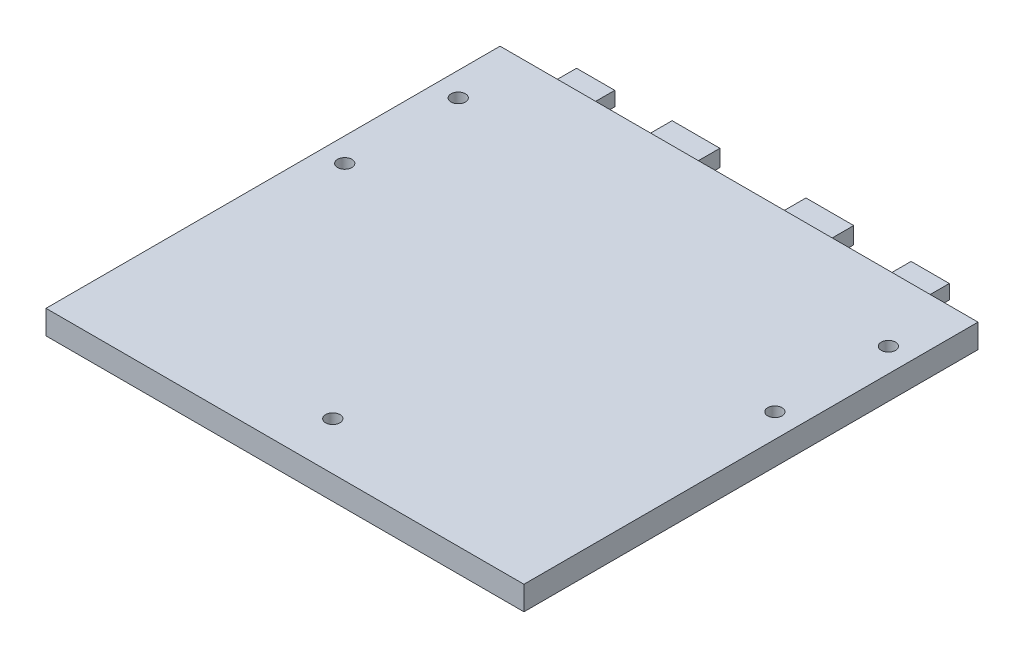
ISO-10303-21;
HEADER;
FILE_DESCRIPTION(('STEP AP214'),'2;1');
FILE_NAME('part.step','',(''),(''),'','','');
FILE_SCHEMA(('AUTOMOTIVE_DESIGN { 1 0 10303 214 1 1 1 1 }'));
ENDSEC;
DATA;
#1=APPLICATION_CONTEXT('core data for automotive mechanical design processes');
#2=APPLICATION_PROTOCOL_DEFINITION('international standard','automotive_design',2000,#1);
#3=PRODUCT_CONTEXT('',#1,'mechanical');
#4=PRODUCT('Part','Part','',(#3));
#5=PRODUCT_RELATED_PRODUCT_CATEGORY('part','',(#4));
#6=PRODUCT_DEFINITION_FORMATION('','',#4);
#7=PRODUCT_DEFINITION_CONTEXT('part definition',#1,'design');
#8=PRODUCT_DEFINITION('design','',#6,#7);
#9=PRODUCT_DEFINITION_SHAPE('','',#8);
#10=(LENGTH_UNIT() NAMED_UNIT(*) SI_UNIT(.MILLI.,.METRE.));
#11=(NAMED_UNIT(*) PLANE_ANGLE_UNIT() SI_UNIT($,.RADIAN.));
#12=(NAMED_UNIT(*) SI_UNIT($,.STERADIAN.) SOLID_ANGLE_UNIT());
#13=UNCERTAINTY_MEASURE_WITH_UNIT(LENGTH_MEASURE(1.E-05),#10,'distance_accuracy_value','');
#14=(GEOMETRIC_REPRESENTATION_CONTEXT(3) GLOBAL_UNCERTAINTY_ASSIGNED_CONTEXT((#13)) GLOBAL_UNIT_ASSIGNED_CONTEXT((#10,
#11,#12)) REPRESENTATION_CONTEXT('',''));
#15=CARTESIAN_POINT('',(0.,0.,0.));
#16=DIRECTION('',(0.,0.,1.));
#17=DIRECTION('',(1.,0.,0.));
#18=AXIS2_PLACEMENT_3D('',#15,#16,#17);
#19=CARTESIAN_POINT('',(0.,10.,0.));
#20=DIRECTION('',(0.,-1.,0.));
#21=DIRECTION('',(0.,0.,-1.));
#22=AXIS2_PLACEMENT_3D('',#19,#20,#21);
#23=PLANE('',#22);
#24=CARTESIAN_POINT('',(100.,10.,-20.));
#25=DIRECTION('',(0.,1.,0.));
#26=DIRECTION('',(0.,0.,1.));
#27=AXIS2_PLACEMENT_3D('',#24,#25,#26);
#28=CIRCLE('',#27,3.00000000000001);
#29=CARTESIAN_POINT('',(100.,10.,-17.));
#30=VERTEX_POINT('',#29);
#31=EDGE_CURVE('E621',#30,#30,#28,.T.);
#32=ORIENTED_EDGE('',*,*,#31,.F.);
#33=EDGE_LOOP('',(#32));
#34=FACE_BOUND('',#33,.T.);
#35=CARTESIAN_POINT('',(190.,10.,-162.5));
#36=DIRECTION('',(0.,1.,0.));
#37=DIRECTION('',(0.,0.,1.));
#38=AXIS2_PLACEMENT_3D('',#35,#36,#37);
#39=CIRCLE('',#38,2.99999999999999);
#40=CARTESIAN_POINT('',(190.,10.,-159.5));
#41=VERTEX_POINT('',#40);
#42=EDGE_CURVE('E632',#41,#41,#39,.T.);
#43=ORIENTED_EDGE('',*,*,#42,.F.);
#44=EDGE_LOOP('',(#43));
#45=FACE_BOUND('',#44,.T.);
#46=CARTESIAN_POINT('',(190.,10.,-115.));
#47=DIRECTION('',(0.,1.,0.));
#48=DIRECTION('',(0.,0.,1.));
#49=AXIS2_PLACEMENT_3D('',#46,#47,#48);
#50=CIRCLE('',#49,2.99999999999999);
#51=CARTESIAN_POINT('',(190.,10.,-112.));
#52=VERTEX_POINT('',#51);
#53=EDGE_CURVE('E635',#52,#52,#50,.T.);
#54=ORIENTED_EDGE('',*,*,#53,.F.);
#55=EDGE_LOOP('',(#54));
#56=FACE_BOUND('',#55,.T.);
#57=DIRECTION('',(0.,0.,1.));
#58=VECTOR('',#57,1.);
#59=CARTESIAN_POINT('',(0.,10.,0.));
#60=LINE('',#59,#58);
#61=CARTESIAN_POINT('',(0.,10.,-190.));
#62=VERTEX_POINT('',#61);
#63=CARTESIAN_POINT('',(0.,10.,0.));
#64=VERTEX_POINT('',#63);
#65=EDGE_CURVE('E299',#62,#64,#60,.T.);
#66=ORIENTED_EDGE('',*,*,#65,.T.);
#67=DIRECTION('',(1.,0.,0.));
#68=VECTOR('',#67,1.);
#69=CARTESIAN_POINT('',(0.,10.,0.));
#70=LINE('',#69,#68);
#71=CARTESIAN_POINT('',(200.,10.,0.));
#72=VERTEX_POINT('',#71);
#73=EDGE_CURVE('E302',#64,#72,#70,.T.);
#74=ORIENTED_EDGE('',*,*,#73,.T.);
#75=DIRECTION('',(0.,0.,-1.));
#76=VECTOR('',#75,1.);
#77=CARTESIAN_POINT('',(200.,10.,0.));
#78=LINE('',#77,#76);
#79=CARTESIAN_POINT('',(200.,10.,-190.));
#80=VERTEX_POINT('',#79);
#81=EDGE_CURVE('E305',#72,#80,#78,.T.);
#82=ORIENTED_EDGE('',*,*,#81,.T.);
#83=DIRECTION('',(-1.,0.,0.));
#84=VECTOR('',#83,1.);
#85=CARTESIAN_POINT('',(0.,10.,-190.));
#86=LINE('',#85,#84);
#87=EDGE_CURVE('E307',#80,#62,#86,.T.);
#88=ORIENTED_EDGE('',*,*,#87,.T.);
#89=EDGE_LOOP('',(#66,#74,#82,#88));
#90=FACE_BOUND('',#89,.T.);
#91=CARTESIAN_POINT('',(10.,10.,-162.5));
#92=DIRECTION('',(0.,-1.,0.));
#93=DIRECTION('',(0.,0.,-1.));
#94=AXIS2_PLACEMENT_3D('',#91,#92,#93);
#95=CIRCLE('',#94,2.99999999999999);
#96=CARTESIAN_POINT('',(10.,10.,-165.5));
#97=VERTEX_POINT('',#96);
#98=EDGE_CURVE('E626',#97,#97,#95,.T.);
#99=ORIENTED_EDGE('',*,*,#98,.T.);
#100=EDGE_LOOP('',(#99));
#101=FACE_BOUND('',#100,.T.);
#102=CARTESIAN_POINT('',(10.,10.,-115.));
#103=DIRECTION('',(0.,-1.,0.));
#104=DIRECTION('',(0.,0.,-1.));
#105=AXIS2_PLACEMENT_3D('',#102,#103,#104);
#106=CIRCLE('',#105,2.99999999999999);
#107=CARTESIAN_POINT('',(10.,10.,-118.));
#108=VERTEX_POINT('',#107);
#109=EDGE_CURVE('E639',#108,#108,#106,.T.);
#110=ORIENTED_EDGE('',*,*,#109,.T.);
#111=EDGE_LOOP('',(#110));
#112=FACE_BOUND('',#111,.T.);
#113=ADVANCED_FACE('F34',(#34,#45,#56,#90,#101,#112),#23,.F.);
#114=CARTESIAN_POINT('',(0.,0.,0.));
#115=DIRECTION('',(0.,-1.,0.));
#116=DIRECTION('',(0.,0.,-1.));
#117=AXIS2_PLACEMENT_3D('',#114,#115,#116);
#118=PLANE('',#117);
#119=CARTESIAN_POINT('',(100.,0.,-20.));
#120=DIRECTION('',(0.,1.,0.));
#121=DIRECTION('',(0.,0.,1.));
#122=AXIS2_PLACEMENT_3D('',#119,#120,#121);
#123=CIRCLE('',#122,3.00000000000001);
#124=CARTESIAN_POINT('',(100.,0.,-17.));
#125=VERTEX_POINT('',#124);
#126=EDGE_CURVE('E619',#125,#125,#123,.T.);
#127=ORIENTED_EDGE('',*,*,#126,.T.);
#128=EDGE_LOOP('',(#127));
#129=FACE_BOUND('',#128,.T.);
#130=CARTESIAN_POINT('',(190.,0.,-162.5));
#131=DIRECTION('',(0.,1.,0.));
#132=DIRECTION('',(0.,0.,1.));
#133=AXIS2_PLACEMENT_3D('',#130,#131,#132);
#134=CIRCLE('',#133,2.99999999999999);
#135=CARTESIAN_POINT('',(190.,0.,-159.5));
#136=VERTEX_POINT('',#135);
#137=EDGE_CURVE('E636',#136,#136,#134,.T.);
#138=ORIENTED_EDGE('',*,*,#137,.T.);
#139=EDGE_LOOP('',(#138));
#140=FACE_BOUND('',#139,.T.);
#141=CARTESIAN_POINT('',(10.,0.,-162.5));
#142=DIRECTION('',(0.,-1.,0.));
#143=DIRECTION('',(0.,0.,-1.));
#144=AXIS2_PLACEMENT_3D('',#141,#142,#143);
#145=CIRCLE('',#144,2.99999999999999);
#146=CARTESIAN_POINT('',(10.,0.,-165.5));
#147=VERTEX_POINT('',#146);
#148=EDGE_CURVE('E623',#147,#147,#145,.T.);
#149=ORIENTED_EDGE('',*,*,#148,.F.);
#150=EDGE_LOOP('',(#149));
#151=FACE_BOUND('',#150,.T.);
#152=CARTESIAN_POINT('',(190.,0.,-115.));
#153=DIRECTION('',(0.,1.,0.));
#154=DIRECTION('',(0.,0.,1.));
#155=AXIS2_PLACEMENT_3D('',#152,#153,#154);
#156=CIRCLE('',#155,2.99999999999999);
#157=CARTESIAN_POINT('',(190.,0.,-112.));
#158=VERTEX_POINT('',#157);
#159=EDGE_CURVE('E644',#158,#158,#156,.T.);
#160=ORIENTED_EDGE('',*,*,#159,.T.);
#161=EDGE_LOOP('',(#160));
#162=FACE_BOUND('',#161,.T.);
#163=DIRECTION('',(0.,0.,1.));
#164=VECTOR('',#163,1.);
#165=CARTESIAN_POINT('',(0.,0.,0.));
#166=LINE('',#165,#164);
#167=CARTESIAN_POINT('',(0.,0.,-190.));
#168=VERTEX_POINT('',#167);
#169=CARTESIAN_POINT('',(0.,0.,0.));
#170=VERTEX_POINT('',#169);
#171=EDGE_CURVE('E290',#168,#170,#166,.T.);
#172=ORIENTED_EDGE('',*,*,#171,.F.);
#173=DIRECTION('',(-1.,0.,0.));
#174=VECTOR('',#173,1.);
#175=CARTESIAN_POINT('',(0.,0.,-190.));
#176=LINE('',#175,#174);
#177=CARTESIAN_POINT('',(200.,0.,-190.));
#178=VERTEX_POINT('',#177);
#179=EDGE_CURVE('E303',#178,#168,#176,.T.);
#180=ORIENTED_EDGE('',*,*,#179,.F.);
#181=DIRECTION('',(0.,0.,-1.));
#182=VECTOR('',#181,1.);
#183=CARTESIAN_POINT('',(200.,0.,0.));
#184=LINE('',#183,#182);
#185=CARTESIAN_POINT('',(200.,0.,0.));
#186=VERTEX_POINT('',#185);
#187=EDGE_CURVE('E314',#186,#178,#184,.T.);
#188=ORIENTED_EDGE('',*,*,#187,.F.);
#189=DIRECTION('',(1.,0.,0.));
#190=VECTOR('',#189,1.);
#191=CARTESIAN_POINT('',(0.,0.,0.));
#192=LINE('',#191,#190);
#193=EDGE_CURVE('E312',#170,#186,#192,.T.);
#194=ORIENTED_EDGE('',*,*,#193,.F.);
#195=EDGE_LOOP('',(#172,#180,#188,#194));
#196=FACE_BOUND('',#195,.T.);
#197=CARTESIAN_POINT('',(10.,0.,-115.));
#198=DIRECTION('',(0.,-1.,0.));
#199=DIRECTION('',(0.,0.,-1.));
#200=AXIS2_PLACEMENT_3D('',#197,#198,#199);
#201=CIRCLE('',#200,2.99999999999999);
#202=CARTESIAN_POINT('',(10.,0.,-118.));
#203=VERTEX_POINT('',#202);
#204=EDGE_CURVE('E629',#203,#203,#201,.T.);
#205=ORIENTED_EDGE('',*,*,#204,.F.);
#206=EDGE_LOOP('',(#205));
#207=FACE_BOUND('',#206,.T.);
#208=ADVANCED_FACE('F332',(#129,#140,#151,#162,#196,#207),#118,.T.);
#209=CARTESIAN_POINT('',(0.,10.,-190.));
#210=DIRECTION('',(0.,0.,1.));
#211=DIRECTION('',(1.,0.,0.));
#212=AXIS2_PLACEMENT_3D('',#209,#210,#211);
#213=PLANE('',#212);
#214=DIRECTION('',(1.,0.,0.));
#215=VECTOR('',#214,1.);
#216=CARTESIAN_POINT('',(62.,9.,-190.));
#217=LINE('',#216,#215);
#218=CARTESIAN_POINT('',(62.,9.,-190.));
#219=VERTEX_POINT('',#218);
#220=CARTESIAN_POINT('',(82.,9.,-190.));
#221=VERTEX_POINT('',#220);
#222=EDGE_CURVE('E255',#219,#221,#217,.T.);
#223=ORIENTED_EDGE('',*,*,#222,.F.);
#224=DIRECTION('',(0.,1.,0.));
#225=VECTOR('',#224,1.);
#226=CARTESIAN_POINT('',(62.,2.,-190.));
#227=LINE('',#226,#225);
#228=CARTESIAN_POINT('',(62.,2.,-190.));
#229=VERTEX_POINT('',#228);
#230=EDGE_CURVE('E247',#229,#219,#227,.T.);
#231=ORIENTED_EDGE('',*,*,#230,.F.);
#232=DIRECTION('',(1.,0.,0.));
#233=VECTOR('',#232,1.);
#234=CARTESIAN_POINT('',(62.,2.,-190.));
#235=LINE('',#234,#233);
#236=CARTESIAN_POINT('',(82.,2.,-190.));
#237=VERTEX_POINT('',#236);
#238=EDGE_CURVE('E250',#229,#237,#235,.T.);
#239=ORIENTED_EDGE('',*,*,#238,.T.);
#240=DIRECTION('',(0.,1.,0.));
#241=VECTOR('',#240,1.);
#242=CARTESIAN_POINT('',(82.,2.,-190.));
#243=LINE('',#242,#241);
#244=EDGE_CURVE('E253',#237,#221,#243,.T.);
#245=ORIENTED_EDGE('',*,*,#244,.T.);
#246=EDGE_LOOP('',(#223,#231,#239,#245));
#247=FACE_BOUND('',#246,.T.);
#248=DIRECTION('',(0.,-1.,0.));
#249=VECTOR('',#248,1.);
#250=CARTESIAN_POINT('',(22.,8.00000000000001,-190.));
#251=LINE('',#250,#249);
#252=CARTESIAN_POINT('',(22.,8.00000000000002,-190.));
#253=VERTEX_POINT('',#252);
#254=CARTESIAN_POINT('',(22.,2.,-190.));
#255=VERTEX_POINT('',#254);
#256=EDGE_CURVE('E271',#253,#255,#251,.T.);
#257=ORIENTED_EDGE('',*,*,#256,.T.);
#258=DIRECTION('',(1.,0.,0.));
#259=VECTOR('',#258,1.);
#260=CARTESIAN_POINT('',(22.,2.,-190.));
#261=LINE('',#260,#259);
#262=CARTESIAN_POINT('',(38.,2.,-190.));
#263=VERTEX_POINT('',#262);
#264=EDGE_CURVE('E258',#255,#263,#261,.T.);
#265=ORIENTED_EDGE('',*,*,#264,.T.);
#266=DIRECTION('',(0.,-1.,0.));
#267=VECTOR('',#266,1.);
#268=CARTESIAN_POINT('',(38.,8.00000000000001,-190.));
#269=LINE('',#268,#267);
#270=CARTESIAN_POINT('',(38.,8.00000000000001,-190.));
#271=VERTEX_POINT('',#270);
#272=EDGE_CURVE('E280',#271,#263,#269,.T.);
#273=ORIENTED_EDGE('',*,*,#272,.F.);
#274=DIRECTION('',(1.,0.,0.));
#275=VECTOR('',#274,1.);
#276=CARTESIAN_POINT('',(22.,8.00000000000001,-190.));
#277=LINE('',#276,#275);
#278=EDGE_CURVE('E283',#253,#271,#277,.T.);
#279=ORIENTED_EDGE('',*,*,#278,.F.);
#280=EDGE_LOOP('',(#257,#265,#273,#279));
#281=FACE_BOUND('',#280,.T.);
#282=ORIENTED_EDGE('',*,*,#179,.T.);
#283=DIRECTION('',(0.,-1.,0.));
#284=VECTOR('',#283,1.);
#285=CARTESIAN_POINT('',(0.,10.,-190.));
#286=LINE('',#285,#284);
#287=EDGE_CURVE('E309',#62,#168,#286,.T.);
#288=ORIENTED_EDGE('',*,*,#287,.F.);
#289=ORIENTED_EDGE('',*,*,#87,.F.);
#290=DIRECTION('',(0.,-1.,0.));
#291=VECTOR('',#290,1.);
#292=CARTESIAN_POINT('',(200.,10.,-190.));
#293=LINE('',#292,#291);
#294=EDGE_CURVE('E319',#80,#178,#293,.T.);
#295=ORIENTED_EDGE('',*,*,#294,.T.);
#296=EDGE_LOOP('',(#282,#288,#289,#295));
#297=FACE_BOUND('',#296,.T.);
#298=DIRECTION('',(-1.,0.,0.));
#299=VECTOR('',#298,1.);
#300=CARTESIAN_POINT('',(138.,2.,-190.));
#301=LINE('',#300,#299);
#302=CARTESIAN_POINT('',(138.,2.,-190.));
#303=VERTEX_POINT('',#302);
#304=CARTESIAN_POINT('',(118.,2.,-190.));
#305=VERTEX_POINT('',#304);
#306=EDGE_CURVE('E216',#303,#305,#301,.T.);
#307=ORIENTED_EDGE('',*,*,#306,.F.);
#308=DIRECTION('',(0.,1.,0.));
#309=VECTOR('',#308,1.);
#310=CARTESIAN_POINT('',(138.,2.,-190.));
#311=LINE('',#310,#309);
#312=CARTESIAN_POINT('',(138.,9.,-190.));
#313=VERTEX_POINT('',#312);
#314=EDGE_CURVE('E223',#303,#313,#311,.T.);
#315=ORIENTED_EDGE('',*,*,#314,.T.);
#316=DIRECTION('',(-1.,0.,0.));
#317=VECTOR('',#316,1.);
#318=CARTESIAN_POINT('',(138.,9.,-190.));
#319=LINE('',#318,#317);
#320=CARTESIAN_POINT('',(118.,9.,-190.));
#321=VERTEX_POINT('',#320);
#322=EDGE_CURVE('E220',#313,#321,#319,.T.);
#323=ORIENTED_EDGE('',*,*,#322,.T.);
#324=DIRECTION('',(0.,1.,0.));
#325=VECTOR('',#324,1.);
#326=CARTESIAN_POINT('',(118.,2.,-190.));
#327=LINE('',#326,#325);
#328=EDGE_CURVE('E57',#305,#321,#327,.T.);
#329=ORIENTED_EDGE('',*,*,#328,.F.);
#330=EDGE_LOOP('',(#307,#315,#323,#329));
#331=FACE_BOUND('',#330,.T.);
#332=DIRECTION('',(0.,-1.,0.));
#333=VECTOR('',#332,1.);
#334=CARTESIAN_POINT('',(178.,7.99999999999999,-190.));
#335=LINE('',#334,#333);
#336=CARTESIAN_POINT('',(178.,7.99999999999999,-190.));
#337=VERTEX_POINT('',#336);
#338=CARTESIAN_POINT('',(178.,1.99999999999998,-190.));
#339=VERTEX_POINT('',#338);
#340=EDGE_CURVE('E178',#337,#339,#335,.T.);
#341=ORIENTED_EDGE('',*,*,#340,.F.);
#342=DIRECTION('',(-1.,0.,0.));
#343=VECTOR('',#342,1.);
#344=CARTESIAN_POINT('',(178.,7.99999999999999,-190.));
#345=LINE('',#344,#343);
#346=CARTESIAN_POINT('',(162.,8.,-190.));
#347=VERTEX_POINT('',#346);
#348=EDGE_CURVE('E189',#337,#347,#345,.T.);
#349=ORIENTED_EDGE('',*,*,#348,.T.);
#350=DIRECTION('',(0.,-1.,0.));
#351=VECTOR('',#350,1.);
#352=CARTESIAN_POINT('',(162.,8.,-190.));
#353=LINE('',#352,#351);
#354=CARTESIAN_POINT('',(162.,1.99999999999999,-190.));
#355=VERTEX_POINT('',#354);
#356=EDGE_CURVE('E49',#347,#355,#353,.T.);
#357=ORIENTED_EDGE('',*,*,#356,.T.);
#358=DIRECTION('',(-1.,0.,0.));
#359=VECTOR('',#358,1.);
#360=CARTESIAN_POINT('',(178.,1.99999999999998,-190.));
#361=LINE('',#360,#359);
#362=EDGE_CURVE('E195',#339,#355,#361,.T.);
#363=ORIENTED_EDGE('',*,*,#362,.F.);
#364=EDGE_LOOP('',(#341,#349,#357,#363));
#365=FACE_BOUND('',#364,.T.);
#366=ADVANCED_FACE('F193',(#247,#281,#297,#331,#365),#213,.F.);
#367=CARTESIAN_POINT('',(0.,10.,0.));
#368=DIRECTION('',(1.,0.,0.));
#369=DIRECTION('',(0.,0.,-1.));
#370=AXIS2_PLACEMENT_3D('',#367,#368,#369);
#371=PLANE('',#370);
#372=ORIENTED_EDGE('',*,*,#171,.T.);
#373=DIRECTION('',(0.,-1.,0.));
#374=VECTOR('',#373,1.);
#375=CARTESIAN_POINT('',(0.,10.,0.));
#376=LINE('',#375,#374);
#377=EDGE_CURVE('E11',#64,#170,#376,.T.);
#378=ORIENTED_EDGE('',*,*,#377,.F.);
#379=ORIENTED_EDGE('',*,*,#65,.F.);
#380=ORIENTED_EDGE('',*,*,#287,.T.);
#381=EDGE_LOOP('',(#372,#378,#379,#380));
#382=FACE_BOUND('',#381,.T.);
#383=ADVANCED_FACE('F36',(#382),#371,.F.);
#384=CARTESIAN_POINT('',(0.,10.,0.));
#385=DIRECTION('',(0.,0.,-1.));
#386=DIRECTION('',(-1.,0.,0.));
#387=AXIS2_PLACEMENT_3D('',#384,#385,#386);
#388=PLANE('',#387);
#389=ORIENTED_EDGE('',*,*,#193,.T.);
#390=DIRECTION('',(0.,-1.,0.));
#391=VECTOR('',#390,1.);
#392=CARTESIAN_POINT('',(200.,10.,0.));
#393=LINE('',#392,#391);
#394=EDGE_CURVE('E42',#72,#186,#393,.T.);
#395=ORIENTED_EDGE('',*,*,#394,.F.);
#396=ORIENTED_EDGE('',*,*,#73,.F.);
#397=ORIENTED_EDGE('',*,*,#377,.T.);
#398=EDGE_LOOP('',(#389,#395,#396,#397));
#399=FACE_BOUND('',#398,.T.);
#400=ADVANCED_FACE('F343',(#399),#388,.F.);
#401=CARTESIAN_POINT('',(200.,10.,0.));
#402=DIRECTION('',(-1.,0.,0.));
#403=DIRECTION('',(0.,0.,1.));
#404=AXIS2_PLACEMENT_3D('',#401,#402,#403);
#405=PLANE('',#404);
#406=ORIENTED_EDGE('',*,*,#187,.T.);
#407=ORIENTED_EDGE('',*,*,#294,.F.);
#408=ORIENTED_EDGE('',*,*,#81,.F.);
#409=ORIENTED_EDGE('',*,*,#394,.T.);
#410=EDGE_LOOP('',(#406,#407,#408,#409));
#411=FACE_BOUND('',#410,.T.);
#412=ADVANCED_FACE('F326',(#411),#405,.F.);
#413=CARTESIAN_POINT('',(22.,2.,-200.));
#414=DIRECTION('',(0.,-1.,0.));
#415=DIRECTION('',(1.,0.,0.));
#416=AXIS2_PLACEMENT_3D('',#413,#414,#415);
#417=PLANE('',#416);
#418=ORIENTED_EDGE('',*,*,#264,.F.);
#419=DIRECTION('',(0.,0.,1.));
#420=VECTOR('',#419,1.);
#421=CARTESIAN_POINT('',(22.,2.,-200.));
#422=LINE('',#421,#420);
#423=CARTESIAN_POINT('',(22.,2.,-200.));
#424=VERTEX_POINT('',#423);
#425=EDGE_CURVE('E287',#424,#255,#422,.T.);
#426=ORIENTED_EDGE('',*,*,#425,.F.);
#427=DIRECTION('',(1.,0.,0.));
#428=VECTOR('',#427,1.);
#429=CARTESIAN_POINT('',(22.,2.,-200.));
#430=LINE('',#429,#428);
#431=CARTESIAN_POINT('',(38.,2.,-200.));
#432=VERTEX_POINT('',#431);
#433=EDGE_CURVE('E267',#424,#432,#430,.T.);
#434=ORIENTED_EDGE('',*,*,#433,.T.);
#435=DIRECTION('',(0.,0.,1.));
#436=VECTOR('',#435,1.);
#437=CARTESIAN_POINT('',(38.,2.,-200.));
#438=LINE('',#437,#436);
#439=EDGE_CURVE('E278',#432,#263,#438,.T.);
#440=ORIENTED_EDGE('',*,*,#439,.T.);
#441=EDGE_LOOP('',(#418,#426,#434,#440));
#442=FACE_BOUND('',#441,.T.);
#443=ADVANCED_FACE('F349',(#442),#417,.T.);
#444=CARTESIAN_POINT('',(22.,8.00000000000001,-200.));
#445=DIRECTION('',(-1.,0.,0.));
#446=DIRECTION('',(0.,-1.,0.));
#447=AXIS2_PLACEMENT_3D('',#444,#445,#446);
#448=PLANE('',#447);
#449=ORIENTED_EDGE('',*,*,#256,.F.);
#450=DIRECTION('',(0.,0.,1.));
#451=VECTOR('',#450,1.);
#452=CARTESIAN_POINT('',(22.,8.00000000000001,-200.));
#453=LINE('',#452,#451);
#454=CARTESIAN_POINT('',(22.,8.00000000000001,-200.));
#455=VERTEX_POINT('',#454);
#456=EDGE_CURVE('E291',#455,#253,#453,.T.);
#457=ORIENTED_EDGE('',*,*,#456,.F.);
#458=DIRECTION('',(0.,-1.,0.));
#459=VECTOR('',#458,1.);
#460=CARTESIAN_POINT('',(22.,8.00000000000001,-200.));
#461=LINE('',#460,#459);
#462=EDGE_CURVE('E275',#455,#424,#461,.T.);
#463=ORIENTED_EDGE('',*,*,#462,.T.);
#464=ORIENTED_EDGE('',*,*,#425,.T.);
#465=EDGE_LOOP('',(#449,#457,#463,#464));
#466=FACE_BOUND('',#465,.T.);
#467=ADVANCED_FACE('F372',(#466),#448,.T.);
#468=CARTESIAN_POINT('',(22.,8.00000000000001,-200.));
#469=DIRECTION('',(0.,-1.,0.));
#470=DIRECTION('',(1.,0.,0.));
#471=AXIS2_PLACEMENT_3D('',#468,#469,#470);
#472=PLANE('',#471);
#473=ORIENTED_EDGE('',*,*,#278,.T.);
#474=DIRECTION('',(0.,0.,1.));
#475=VECTOR('',#474,1.);
#476=CARTESIAN_POINT('',(38.,8.00000000000001,-200.));
#477=LINE('',#476,#475);
#478=CARTESIAN_POINT('',(38.,8.00000000000001,-200.));
#479=VERTEX_POINT('',#478);
#480=EDGE_CURVE('E294',#479,#271,#477,.T.);
#481=ORIENTED_EDGE('',*,*,#480,.F.);
#482=DIRECTION('',(1.,0.,0.));
#483=VECTOR('',#482,1.);
#484=CARTESIAN_POINT('',(22.,8.00000000000001,-200.));
#485=LINE('',#484,#483);
#486=EDGE_CURVE('E273',#455,#479,#485,.T.);
#487=ORIENTED_EDGE('',*,*,#486,.F.);
#488=ORIENTED_EDGE('',*,*,#456,.T.);
#489=EDGE_LOOP('',(#473,#481,#487,#488));
#490=FACE_BOUND('',#489,.T.);
#491=ADVANCED_FACE('F382',(#490),#472,.F.);
#492=CARTESIAN_POINT('',(38.,8.00000000000001,-200.));
#493=DIRECTION('',(-1.,0.,0.));
#494=DIRECTION('',(0.,0.,1.));
#495=AXIS2_PLACEMENT_3D('',#492,#493,#494);
#496=PLANE('',#495);
#497=ORIENTED_EDGE('',*,*,#272,.T.);
#498=ORIENTED_EDGE('',*,*,#439,.F.);
#499=DIRECTION('',(0.,-1.,0.));
#500=VECTOR('',#499,1.);
#501=CARTESIAN_POINT('',(38.,8.00000000000001,-200.));
#502=LINE('',#501,#500);
#503=EDGE_CURVE('E270',#479,#432,#502,.T.);
#504=ORIENTED_EDGE('',*,*,#503,.F.);
#505=ORIENTED_EDGE('',*,*,#480,.T.);
#506=EDGE_LOOP('',(#497,#498,#504,#505));
#507=FACE_BOUND('',#506,.T.);
#508=ADVANCED_FACE('F379',(#507),#496,.F.);
#509=CARTESIAN_POINT('',(0.,0.,-200.));
#510=DIRECTION('',(0.,0.,-1.));
#511=DIRECTION('',(-1.,0.,0.));
#512=AXIS2_PLACEMENT_3D('',#509,#510,#511);
#513=PLANE('',#512);
#514=ORIENTED_EDGE('',*,*,#433,.F.);
#515=ORIENTED_EDGE('',*,*,#462,.F.);
#516=ORIENTED_EDGE('',*,*,#486,.T.);
#517=ORIENTED_EDGE('',*,*,#503,.T.);
#518=EDGE_LOOP('',(#514,#515,#516,#517));
#519=FACE_BOUND('',#518,.T.);
#520=ADVANCED_FACE('F385',(#519),#513,.T.);
#521=CARTESIAN_POINT('',(62.,9.,-200.));
#522=DIRECTION('',(0.,-1.,0.));
#523=DIRECTION('',(1.,0.,0.));
#524=AXIS2_PLACEMENT_3D('',#521,#522,#523);
#525=PLANE('',#524);
#526=ORIENTED_EDGE('',*,*,#222,.T.);
#527=DIRECTION('',(0.,0.,1.));
#528=VECTOR('',#527,1.);
#529=CARTESIAN_POINT('',(82.,9.,-200.));
#530=LINE('',#529,#528);
#531=CARTESIAN_POINT('',(82.,9.,-200.));
#532=VERTEX_POINT('',#531);
#533=EDGE_CURVE('E226',#532,#221,#530,.T.);
#534=ORIENTED_EDGE('',*,*,#533,.F.);
#535=DIRECTION('',(1.,0.,0.));
#536=VECTOR('',#535,1.);
#537=CARTESIAN_POINT('',(62.,9.,-200.));
#538=LINE('',#537,#536);
#539=CARTESIAN_POINT('',(62.,9.,-200.));
#540=VERTEX_POINT('',#539);
#541=EDGE_CURVE('E251',#540,#532,#538,.T.);
#542=ORIENTED_EDGE('',*,*,#541,.F.);
#543=DIRECTION('',(0.,0.,1.));
#544=VECTOR('',#543,1.);
#545=CARTESIAN_POINT('',(62.,9.,-200.));
#546=LINE('',#545,#544);
#547=EDGE_CURVE('E243',#540,#219,#546,.T.);
#548=ORIENTED_EDGE('',*,*,#547,.T.);
#549=EDGE_LOOP('',(#526,#534,#542,#548));
#550=FACE_BOUND('',#549,.T.);
#551=ADVANCED_FACE('F387',(#550),#525,.F.);
#552=CARTESIAN_POINT('',(82.,2.,-200.));
#553=DIRECTION('',(1.,0.,0.));
#554=DIRECTION('',(0.,0.,-1.));
#555=AXIS2_PLACEMENT_3D('',#552,#553,#554);
#556=PLANE('',#555);
#557=ORIENTED_EDGE('',*,*,#244,.F.);
#558=DIRECTION('',(0.,0.,1.));
#559=VECTOR('',#558,1.);
#560=CARTESIAN_POINT('',(82.,2.,-200.));
#561=LINE('',#560,#559);
#562=CARTESIAN_POINT('',(82.,2.,-200.));
#563=VERTEX_POINT('',#562);
#564=EDGE_CURVE('E237',#563,#237,#561,.T.);
#565=ORIENTED_EDGE('',*,*,#564,.F.);
#566=DIRECTION('',(0.,1.,0.));
#567=VECTOR('',#566,1.);
#568=CARTESIAN_POINT('',(82.,2.,-200.));
#569=LINE('',#568,#567);
#570=EDGE_CURVE('E263',#563,#532,#569,.T.);
#571=ORIENTED_EDGE('',*,*,#570,.T.);
#572=ORIENTED_EDGE('',*,*,#533,.T.);
#573=EDGE_LOOP('',(#557,#565,#571,#572));
#574=FACE_BOUND('',#573,.T.);
#575=ADVANCED_FACE('F393',(#574),#556,.T.);
#576=CARTESIAN_POINT('',(62.,2.,-200.));
#577=DIRECTION('',(0.,-1.,0.));
#578=DIRECTION('',(1.,0.,0.));
#579=AXIS2_PLACEMENT_3D('',#576,#577,#578);
#580=PLANE('',#579);
#581=ORIENTED_EDGE('',*,*,#238,.F.);
#582=DIRECTION('',(0.,0.,1.));
#583=VECTOR('',#582,1.);
#584=CARTESIAN_POINT('',(62.,2.,-200.));
#585=LINE('',#584,#583);
#586=CARTESIAN_POINT('',(62.,2.,-200.));
#587=VERTEX_POINT('',#586);
#588=EDGE_CURVE('E240',#587,#229,#585,.T.);
#589=ORIENTED_EDGE('',*,*,#588,.F.);
#590=DIRECTION('',(1.,0.,0.));
#591=VECTOR('',#590,1.);
#592=CARTESIAN_POINT('',(62.,2.,-200.));
#593=LINE('',#592,#591);
#594=EDGE_CURVE('E260',#587,#563,#593,.T.);
#595=ORIENTED_EDGE('',*,*,#594,.T.);
#596=ORIENTED_EDGE('',*,*,#564,.T.);
#597=EDGE_LOOP('',(#581,#589,#595,#596));
#598=FACE_BOUND('',#597,.T.);
#599=ADVANCED_FACE('F431',(#598),#580,.T.);
#600=CARTESIAN_POINT('',(62.,2.,-200.));
#601=DIRECTION('',(1.,0.,0.));
#602=DIRECTION('',(0.,0.,-1.));
#603=AXIS2_PLACEMENT_3D('',#600,#601,#602);
#604=PLANE('',#603);
#605=ORIENTED_EDGE('',*,*,#230,.T.);
#606=ORIENTED_EDGE('',*,*,#547,.F.);
#607=DIRECTION('',(0.,1.,0.));
#608=VECTOR('',#607,1.);
#609=CARTESIAN_POINT('',(62.,2.,-200.));
#610=LINE('',#609,#608);
#611=EDGE_CURVE('E246',#587,#540,#610,.T.);
#612=ORIENTED_EDGE('',*,*,#611,.F.);
#613=ORIENTED_EDGE('',*,*,#588,.T.);
#614=EDGE_LOOP('',(#605,#606,#612,#613));
#615=FACE_BOUND('',#614,.T.);
#616=ADVANCED_FACE('F441',(#615),#604,.F.);
#617=CARTESIAN_POINT('',(0.,0.,-200.));
#618=DIRECTION('',(0.,0.,1.));
#619=DIRECTION('',(1.,0.,0.));
#620=AXIS2_PLACEMENT_3D('',#617,#618,#619);
#621=PLANE('',#620);
#622=ORIENTED_EDGE('',*,*,#541,.T.);
#623=ORIENTED_EDGE('',*,*,#570,.F.);
#624=ORIENTED_EDGE('',*,*,#594,.F.);
#625=ORIENTED_EDGE('',*,*,#611,.T.);
#626=EDGE_LOOP('',(#622,#623,#624,#625));
#627=FACE_BOUND('',#626,.T.);
#628=ADVANCED_FACE('F398',(#627),#621,.F.);
#629=CARTESIAN_POINT('',(138.,2.,-200.));
#630=DIRECTION('',(1.,0.,0.));
#631=DIRECTION('',(0.,0.,-1.));
#632=AXIS2_PLACEMENT_3D('',#629,#630,#631);
#633=PLANE('',#632);
#634=ORIENTED_EDGE('',*,*,#314,.F.);
#635=DIRECTION('',(0.,0.,1.));
#636=VECTOR('',#635,1.);
#637=CARTESIAN_POINT('',(138.,2.,-200.));
#638=LINE('',#637,#636);
#639=CARTESIAN_POINT('',(138.,2.,-200.));
#640=VERTEX_POINT('',#639);
#641=EDGE_CURVE('E196',#640,#303,#638,.T.);
#642=ORIENTED_EDGE('',*,*,#641,.F.);
#643=DIRECTION('',(0.,1.,0.));
#644=VECTOR('',#643,1.);
#645=CARTESIAN_POINT('',(138.,2.,-200.));
#646=LINE('',#645,#644);
#647=CARTESIAN_POINT('',(138.,9.,-200.));
#648=VERTEX_POINT('',#647);
#649=EDGE_CURVE('E218',#640,#648,#646,.T.);
#650=ORIENTED_EDGE('',*,*,#649,.T.);
#651=DIRECTION('',(0.,0.,1.));
#652=VECTOR('',#651,1.);
#653=CARTESIAN_POINT('',(138.,9.,-200.));
#654=LINE('',#653,#652);
#655=EDGE_CURVE('E210',#648,#313,#654,.T.);
#656=ORIENTED_EDGE('',*,*,#655,.T.);
#657=EDGE_LOOP('',(#634,#642,#650,#656));
#658=FACE_BOUND('',#657,.T.);
#659=ADVANCED_FACE('F459',(#658),#633,.T.);
#660=CARTESIAN_POINT('',(138.,2.,-200.));
#661=DIRECTION('',(0.,1.,0.));
#662=DIRECTION('',(-1.,0.,0.));
#663=AXIS2_PLACEMENT_3D('',#660,#661,#662);
#664=PLANE('',#663);
#665=ORIENTED_EDGE('',*,*,#306,.T.);
#666=DIRECTION('',(0.,0.,1.));
#667=VECTOR('',#666,1.);
#668=CARTESIAN_POINT('',(118.,2.,-200.));
#669=LINE('',#668,#667);
#670=CARTESIAN_POINT('',(118.,2.,-200.));
#671=VERTEX_POINT('',#670);
#672=EDGE_CURVE('E198',#671,#305,#669,.T.);
#673=ORIENTED_EDGE('',*,*,#672,.F.);
#674=DIRECTION('',(-1.,0.,0.));
#675=VECTOR('',#674,1.);
#676=CARTESIAN_POINT('',(138.,2.,-200.));
#677=LINE('',#676,#675);
#678=EDGE_CURVE('E212',#640,#671,#677,.T.);
#679=ORIENTED_EDGE('',*,*,#678,.F.);
#680=ORIENTED_EDGE('',*,*,#641,.T.);
#681=EDGE_LOOP('',(#665,#673,#679,#680));
#682=FACE_BOUND('',#681,.T.);
#683=ADVANCED_FACE('F468',(#682),#664,.F.);
#684=CARTESIAN_POINT('',(118.,2.,-200.));
#685=DIRECTION('',(1.,0.,0.));
#686=DIRECTION('',(0.,0.,-1.));
#687=AXIS2_PLACEMENT_3D('',#684,#685,#686);
#688=PLANE('',#687);
#689=ORIENTED_EDGE('',*,*,#328,.T.);
#690=DIRECTION('',(0.,0.,1.));
#691=VECTOR('',#690,1.);
#692=CARTESIAN_POINT('',(118.,9.,-200.));
#693=LINE('',#692,#691);
#694=CARTESIAN_POINT('',(118.,9.,-200.));
#695=VERTEX_POINT('',#694);
#696=EDGE_CURVE('E213',#695,#321,#693,.T.);
#697=ORIENTED_EDGE('',*,*,#696,.F.);
#698=DIRECTION('',(0.,1.,0.));
#699=VECTOR('',#698,1.);
#700=CARTESIAN_POINT('',(118.,2.,-200.));
#701=LINE('',#700,#699);
#702=EDGE_CURVE('E228',#671,#695,#701,.T.);
#703=ORIENTED_EDGE('',*,*,#702,.F.);
#704=ORIENTED_EDGE('',*,*,#672,.T.);
#705=EDGE_LOOP('',(#689,#697,#703,#704));
#706=FACE_BOUND('',#705,.T.);
#707=ADVANCED_FACE('F478',(#706),#688,.F.);
#708=CARTESIAN_POINT('',(138.,9.,-200.));
#709=DIRECTION('',(0.,1.,0.));
#710=DIRECTION('',(-1.,0.,0.));
#711=AXIS2_PLACEMENT_3D('',#708,#709,#710);
#712=PLANE('',#711);
#713=ORIENTED_EDGE('',*,*,#322,.F.);
#714=ORIENTED_EDGE('',*,*,#655,.F.);
#715=DIRECTION('',(-1.,0.,0.));
#716=VECTOR('',#715,1.);
#717=CARTESIAN_POINT('',(138.,9.,-200.));
#718=LINE('',#717,#716);
#719=EDGE_CURVE('E230',#648,#695,#718,.T.);
#720=ORIENTED_EDGE('',*,*,#719,.T.);
#721=ORIENTED_EDGE('',*,*,#696,.T.);
#722=EDGE_LOOP('',(#713,#714,#720,#721));
#723=FACE_BOUND('',#722,.T.);
#724=ADVANCED_FACE('F488',(#723),#712,.T.);
#725=CARTESIAN_POINT('',(0.,0.,-200.));
#726=DIRECTION('',(0.,0.,1.));
#727=DIRECTION('',(1.,0.,0.));
#728=AXIS2_PLACEMENT_3D('',#725,#726,#727);
#729=PLANE('',#728);
#730=ORIENTED_EDGE('',*,*,#649,.F.);
#731=ORIENTED_EDGE('',*,*,#678,.T.);
#732=ORIENTED_EDGE('',*,*,#702,.T.);
#733=ORIENTED_EDGE('',*,*,#719,.F.);
#734=EDGE_LOOP('',(#730,#731,#732,#733));
#735=FACE_BOUND('',#734,.T.);
#736=ADVANCED_FACE('F497',(#735),#729,.F.);
#737=CARTESIAN_POINT('',(178.,7.99999999999999,-200.));
#738=DIRECTION('',(-1.,0.,0.));
#739=DIRECTION('',(0.,0.,1.));
#740=AXIS2_PLACEMENT_3D('',#737,#738,#739);
#741=PLANE('',#740);
#742=ORIENTED_EDGE('',*,*,#340,.T.);
#743=DIRECTION('',(0.,0.,1.));
#744=VECTOR('',#743,1.);
#745=CARTESIAN_POINT('',(178.,1.99999999999998,-200.));
#746=LINE('',#745,#744);
#747=CARTESIAN_POINT('',(178.,1.99999999999998,-200.));
#748=VERTEX_POINT('',#747);
#749=EDGE_CURVE('E647',#748,#339,#746,.T.);
#750=ORIENTED_EDGE('',*,*,#749,.F.);
#751=DIRECTION('',(0.,-1.,0.));
#752=VECTOR('',#751,1.);
#753=CARTESIAN_POINT('',(178.,7.99999999999999,-200.));
#754=LINE('',#753,#752);
#755=CARTESIAN_POINT('',(178.,7.99999999999999,-200.));
#756=VERTEX_POINT('',#755);
#757=EDGE_CURVE('E181',#756,#748,#754,.T.);
#758=ORIENTED_EDGE('',*,*,#757,.F.);
#759=DIRECTION('',(0.,0.,1.));
#760=VECTOR('',#759,1.);
#761=CARTESIAN_POINT('',(178.,7.99999999999999,-200.));
#762=LINE('',#761,#760);
#763=EDGE_CURVE('E173',#756,#337,#762,.T.);
#764=ORIENTED_EDGE('',*,*,#763,.T.);
#765=EDGE_LOOP('',(#742,#750,#758,#764));
#766=FACE_BOUND('',#765,.T.);
#767=ADVANCED_FACE('F175',(#766),#741,.F.);
#768=CARTESIAN_POINT('',(178.,1.99999999999998,-200.));
#769=DIRECTION('',(0.,1.,0.));
#770=DIRECTION('',(-1.,0.,0.));
#771=AXIS2_PLACEMENT_3D('',#768,#769,#770);
#772=PLANE('',#771);
#773=ORIENTED_EDGE('',*,*,#362,.T.);
#774=DIRECTION('',(0.,0.,1.));
#775=VECTOR('',#774,1.);
#776=CARTESIAN_POINT('',(162.,1.99999999999999,-200.));
#777=LINE('',#776,#775);
#778=CARTESIAN_POINT('',(162.,1.99999999999999,-200.));
#779=VERTEX_POINT('',#778);
#780=EDGE_CURVE('E651',#779,#355,#777,.T.);
#781=ORIENTED_EDGE('',*,*,#780,.F.);
#782=DIRECTION('',(-1.,0.,0.));
#783=VECTOR('',#782,1.);
#784=CARTESIAN_POINT('',(178.,1.99999999999998,-200.));
#785=LINE('',#784,#783);
#786=EDGE_CURVE('E207',#748,#779,#785,.T.);
#787=ORIENTED_EDGE('',*,*,#786,.F.);
#788=ORIENTED_EDGE('',*,*,#749,.T.);
#789=EDGE_LOOP('',(#773,#781,#787,#788));
#790=FACE_BOUND('',#789,.T.);
#791=ADVANCED_FACE('F516',(#790),#772,.F.);
#792=CARTESIAN_POINT('',(162.,8.,-200.));
#793=DIRECTION('',(-1.,0.,0.));
#794=DIRECTION('',(0.,0.,1.));
#795=AXIS2_PLACEMENT_3D('',#792,#793,#794);
#796=PLANE('',#795);
#797=ORIENTED_EDGE('',*,*,#356,.F.);
#798=DIRECTION('',(0.,0.,1.));
#799=VECTOR('',#798,1.);
#800=CARTESIAN_POINT('',(162.,8.,-200.));
#801=LINE('',#800,#799);
#802=CARTESIAN_POINT('',(162.,8.,-200.));
#803=VERTEX_POINT('',#802);
#804=EDGE_CURVE('E186',#803,#347,#801,.T.);
#805=ORIENTED_EDGE('',*,*,#804,.F.);
#806=DIRECTION('',(0.,-1.,0.));
#807=VECTOR('',#806,1.);
#808=CARTESIAN_POINT('',(162.,8.,-200.));
#809=LINE('',#808,#807);
#810=EDGE_CURVE('E204',#803,#779,#809,.T.);
#811=ORIENTED_EDGE('',*,*,#810,.T.);
#812=ORIENTED_EDGE('',*,*,#780,.T.);
#813=EDGE_LOOP('',(#797,#805,#811,#812));
#814=FACE_BOUND('',#813,.T.);
#815=ADVANCED_FACE('F525',(#814),#796,.T.);
#816=CARTESIAN_POINT('',(178.,7.99999999999999,-200.));
#817=DIRECTION('',(0.,1.,0.));
#818=DIRECTION('',(-1.,0.,0.));
#819=AXIS2_PLACEMENT_3D('',#816,#817,#818);
#820=PLANE('',#819);
#821=ORIENTED_EDGE('',*,*,#348,.F.);
#822=ORIENTED_EDGE('',*,*,#763,.F.);
#823=DIRECTION('',(-1.,0.,0.));
#824=VECTOR('',#823,1.);
#825=CARTESIAN_POINT('',(178.,7.99999999999999,-200.));
#826=LINE('',#825,#824);
#827=EDGE_CURVE('E185',#756,#803,#826,.T.);
#828=ORIENTED_EDGE('',*,*,#827,.T.);
#829=ORIENTED_EDGE('',*,*,#804,.T.);
#830=EDGE_LOOP('',(#821,#822,#828,#829));
#831=FACE_BOUND('',#830,.T.);
#832=ADVANCED_FACE('F190',(#831),#820,.T.);
#833=CARTESIAN_POINT('',(0.,0.,-200.));
#834=DIRECTION('',(0.,0.,-1.));
#835=DIRECTION('',(-1.,0.,0.));
#836=AXIS2_PLACEMENT_3D('',#833,#834,#835);
#837=PLANE('',#836);
#838=ORIENTED_EDGE('',*,*,#757,.T.);
#839=ORIENTED_EDGE('',*,*,#786,.T.);
#840=ORIENTED_EDGE('',*,*,#810,.F.);
#841=ORIENTED_EDGE('',*,*,#827,.F.);
#842=EDGE_LOOP('',(#838,#839,#840,#841));
#843=FACE_BOUND('',#842,.T.);
#844=ADVANCED_FACE('F543',(#843),#837,.T.);
#845=CARTESIAN_POINT('',(190.,0.,-115.));
#846=DIRECTION('',(0.,1.,0.));
#847=DIRECTION('',(0.,0.,1.));
#848=AXIS2_PLACEMENT_3D('',#845,#846,#847);
#849=CYLINDRICAL_SURFACE('',#848,2.99999999999999);
#850=ORIENTED_EDGE('',*,*,#159,.F.);
#851=EDGE_LOOP('',(#850));
#852=FACE_BOUND('',#851,.T.);
#853=ORIENTED_EDGE('',*,*,#53,.T.);
#854=EDGE_LOOP('',(#853));
#855=FACE_BOUND('',#854,.T.);
#856=ADVANCED_FACE('F552',(#852,#855),#849,.F.);
#857=CARTESIAN_POINT('',(10.,0.,-162.5));
#858=DIRECTION('',(0.,1.,0.));
#859=DIRECTION('',(0.,0.,1.));
#860=AXIS2_PLACEMENT_3D('',#857,#858,#859);
#861=CYLINDRICAL_SURFACE('',#860,2.99999999999999);
#862=ORIENTED_EDGE('',*,*,#148,.T.);
#863=EDGE_LOOP('',(#862));
#864=FACE_BOUND('',#863,.T.);
#865=ORIENTED_EDGE('',*,*,#98,.F.);
#866=EDGE_LOOP('',(#865));
#867=FACE_BOUND('',#866,.T.);
#868=ADVANCED_FACE('F563',(#864,#867),#861,.F.);
#869=CARTESIAN_POINT('',(10.,0.,-115.));
#870=DIRECTION('',(0.,1.,0.));
#871=DIRECTION('',(0.,0.,1.));
#872=AXIS2_PLACEMENT_3D('',#869,#870,#871);
#873=CYLINDRICAL_SURFACE('',#872,2.99999999999999);
#874=ORIENTED_EDGE('',*,*,#204,.T.);
#875=EDGE_LOOP('',(#874));
#876=FACE_BOUND('',#875,.T.);
#877=ORIENTED_EDGE('',*,*,#109,.F.);
#878=EDGE_LOOP('',(#877));
#879=FACE_BOUND('',#878,.T.);
#880=ADVANCED_FACE('F574',(#876,#879),#873,.F.);
#881=CARTESIAN_POINT('',(190.,0.,-162.5));
#882=DIRECTION('',(0.,1.,0.));
#883=DIRECTION('',(0.,0.,1.));
#884=AXIS2_PLACEMENT_3D('',#881,#882,#883);
#885=CYLINDRICAL_SURFACE('',#884,2.99999999999999);
#886=ORIENTED_EDGE('',*,*,#137,.F.);
#887=EDGE_LOOP('',(#886));
#888=FACE_BOUND('',#887,.T.);
#889=ORIENTED_EDGE('',*,*,#42,.T.);
#890=EDGE_LOOP('',(#889));
#891=FACE_BOUND('',#890,.T.);
#892=ADVANCED_FACE('F584',(#888,#891),#885,.F.);
#893=CARTESIAN_POINT('',(100.,0.,-20.));
#894=DIRECTION('',(0.,1.,0.));
#895=DIRECTION('',(0.,0.,1.));
#896=AXIS2_PLACEMENT_3D('',#893,#894,#895);
#897=CYLINDRICAL_SURFACE('',#896,3.00000000000001);
#898=ORIENTED_EDGE('',*,*,#126,.F.);
#899=EDGE_LOOP('',(#898));
#900=FACE_BOUND('',#899,.T.);
#901=ORIENTED_EDGE('',*,*,#31,.T.);
#902=EDGE_LOOP('',(#901));
#903=FACE_BOUND('',#902,.T.);
#904=ADVANCED_FACE('F593',(#900,#903),#897,.F.);
#905=CLOSED_SHELL('',(#113,#208,#366,#383,#400,#412,#443,#467,#491,#508,#520,#551,#575,#599,
#616,#628,#659,#683,#707,#724,#736,#767,#791,#815,#832,#844,#856,#868,#880,#892,#904));
#906=MANIFOLD_SOLID_BREP('B2',#905);
#907=ADVANCED_BREP_SHAPE_REPRESENTATION('',(#18,#906),#14);
#908=SHAPE_DEFINITION_REPRESENTATION(#9,#907);
ENDSEC;
END-ISO-10303-21;
